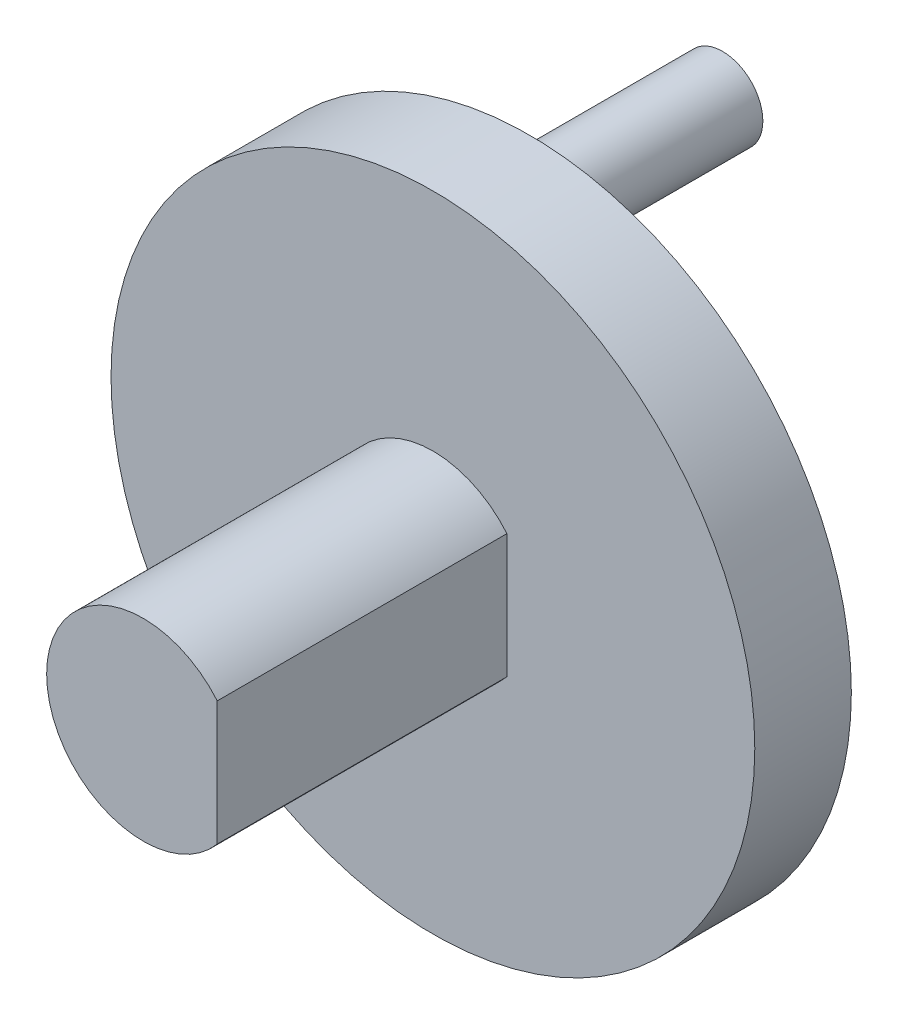
ISO-10303-21;
HEADER;
FILE_DESCRIPTION(('STEP AP214'),'2;1');
FILE_NAME('part.step','',(''),(''),'','','');
FILE_SCHEMA(('AUTOMOTIVE_DESIGN { 1 0 10303 214 1 1 1 1 }'));
ENDSEC;
DATA;
#1=APPLICATION_CONTEXT('core data for automotive mechanical design processes');
#2=APPLICATION_PROTOCOL_DEFINITION('international standard','automotive_design',2000,#1);
#3=PRODUCT_CONTEXT('',#1,'mechanical');
#4=PRODUCT('Part','Part','',(#3));
#5=PRODUCT_RELATED_PRODUCT_CATEGORY('part','',(#4));
#6=PRODUCT_DEFINITION_FORMATION('','',#4);
#7=PRODUCT_DEFINITION_CONTEXT('part definition',#1,'design');
#8=PRODUCT_DEFINITION('design','',#6,#7);
#9=PRODUCT_DEFINITION_SHAPE('','',#8);
#10=(LENGTH_UNIT() NAMED_UNIT(*) SI_UNIT(.MILLI.,.METRE.));
#11=(NAMED_UNIT(*) PLANE_ANGLE_UNIT() SI_UNIT($,.RADIAN.));
#12=(NAMED_UNIT(*) SI_UNIT($,.STERADIAN.) SOLID_ANGLE_UNIT());
#13=UNCERTAINTY_MEASURE_WITH_UNIT(LENGTH_MEASURE(1.E-05),#10,'distance_accuracy_value','');
#14=(GEOMETRIC_REPRESENTATION_CONTEXT(3) GLOBAL_UNCERTAINTY_ASSIGNED_CONTEXT((#13)) GLOBAL_UNIT_ASSIGNED_CONTEXT((#10,
#11,#12)) REPRESENTATION_CONTEXT('',''));
#15=CARTESIAN_POINT('',(0.,0.,0.));
#16=DIRECTION('',(0.,0.,1.));
#17=DIRECTION('',(1.,0.,0.));
#18=AXIS2_PLACEMENT_3D('',#15,#16,#17);
#19=CARTESIAN_POINT('',(0.,0.,12.));
#20=DIRECTION('',(0.,0.,1.));
#21=DIRECTION('',(1.,0.,0.));
#22=AXIS2_PLACEMENT_3D('',#19,#20,#21);
#23=PLANE('',#22);
#24=DIRECTION('',(0.,-1.,0.));
#25=VECTOR('',#24,1.);
#26=CARTESIAN_POINT('',(2.3,4.,12.));
#27=LINE('',#26,#25);
#28=CARTESIAN_POINT('',(2.3,1.926136028426,12.));
#29=VERTEX_POINT('',#28);
#30=CARTESIAN_POINT('',(2.3,-1.926136028426,12.));
#31=VERTEX_POINT('',#30);
#32=EDGE_CURVE('E10',#29,#31,#27,.T.);
#33=ORIENTED_EDGE('',*,*,#32,.F.);
#34=CARTESIAN_POINT('',(0.,0.,12.));
#35=DIRECTION('',(0.,0.,1.));
#36=DIRECTION('',(1.,0.,0.));
#37=AXIS2_PLACEMENT_3D('',#34,#35,#36);
#38=CIRCLE('',#37,3.);
#39=EDGE_CURVE('E75',#29,#31,#38,.T.);
#40=ORIENTED_EDGE('',*,*,#39,.T.);
#41=EDGE_LOOP('',(#33,#40));
#42=FACE_BOUND('',#41,.T.);
#43=ADVANCED_FACE('F16',(#42),#23,.T.);
#44=CARTESIAN_POINT('',(0.,8.,-6.));
#45=DIRECTION('',(0.,0.,1.));
#46=DIRECTION('',(1.,0.,0.));
#47=AXIS2_PLACEMENT_3D('',#44,#45,#46);
#48=PLANE('',#47);
#49=CARTESIAN_POINT('',(0.,8.,-6.));
#50=DIRECTION('',(0.,0.,1.));
#51=DIRECTION('',(1.,0.,0.));
#52=AXIS2_PLACEMENT_3D('',#49,#50,#51);
#53=CIRCLE('',#52,1.25);
#54=CARTESIAN_POINT('',(1.25,8.,-6.));
#55=VERTEX_POINT('',#54);
#56=EDGE_CURVE('E66',#55,#55,#53,.T.);
#57=ORIENTED_EDGE('',*,*,#56,.F.);
#58=EDGE_LOOP('',(#57));
#59=FACE_BOUND('',#58,.T.);
#60=ADVANCED_FACE('F152',(#59),#48,.F.);
#61=CARTESIAN_POINT('',(0.,-8.,-6.));
#62=DIRECTION('',(0.,0.,1.));
#63=DIRECTION('',(1.,0.,0.));
#64=AXIS2_PLACEMENT_3D('',#61,#62,#63);
#65=PLANE('',#64);
#66=CARTESIAN_POINT('',(0.,-8.,-6.));
#67=DIRECTION('',(0.,0.,1.));
#68=DIRECTION('',(1.,0.,0.));
#69=AXIS2_PLACEMENT_3D('',#66,#67,#68);
#70=CIRCLE('',#69,1.25);
#71=CARTESIAN_POINT('',(1.25,-8.,-6.));
#72=VERTEX_POINT('',#71);
#73=EDGE_CURVE('E98',#72,#72,#70,.T.);
#74=ORIENTED_EDGE('',*,*,#73,.F.);
#75=EDGE_LOOP('',(#74));
#76=FACE_BOUND('',#75,.T.);
#77=ADVANCED_FACE('F156',(#76),#65,.F.);
#78=CARTESIAN_POINT('',(2.3,4.,3.));
#79=DIRECTION('',(1.,0.,0.));
#80=DIRECTION('',(0.,1.,0.));
#81=AXIS2_PLACEMENT_3D('',#78,#79,#80);
#82=PLANE('',#81);
#83=DIRECTION('',(0.,-1.,0.));
#84=VECTOR('',#83,1.);
#85=CARTESIAN_POINT('',(2.3,4.,3.));
#86=LINE('',#85,#84);
#87=CARTESIAN_POINT('',(2.3,1.926136028426,3.));
#88=VERTEX_POINT('',#87);
#89=CARTESIAN_POINT('',(2.3,-1.926136028426,3.));
#90=VERTEX_POINT('',#89);
#91=EDGE_CURVE('E94',#88,#90,#86,.T.);
#92=ORIENTED_EDGE('',*,*,#91,.F.);
#93=DIRECTION('',(0.,0.,-1.));
#94=VECTOR('',#93,1.);
#95=CARTESIAN_POINT('',(2.3,1.926136028426,3.));
#96=LINE('',#95,#94);
#97=EDGE_CURVE('E25',#29,#88,#96,.T.);
#98=ORIENTED_EDGE('',*,*,#97,.F.);
#99=ORIENTED_EDGE('',*,*,#32,.T.);
#100=DIRECTION('',(0.,0.,-1.));
#101=VECTOR('',#100,1.);
#102=CARTESIAN_POINT('',(2.3,-1.926136028426,3.));
#103=LINE('',#102,#101);
#104=EDGE_CURVE('E70',#31,#90,#103,.T.);
#105=ORIENTED_EDGE('',*,*,#104,.T.);
#106=EDGE_LOOP('',(#92,#98,#99,#105));
#107=FACE_BOUND('',#106,.T.);
#108=ADVANCED_FACE('F95',(#107),#82,.T.);
#109=CARTESIAN_POINT('',(0.,0.,3.));
#110=DIRECTION('',(0.,0.,-1.));
#111=DIRECTION('',(1.,0.,0.));
#112=AXIS2_PLACEMENT_3D('',#109,#110,#111);
#113=CYLINDRICAL_SURFACE('',#112,3.);
#114=ORIENTED_EDGE('',*,*,#104,.F.);
#115=ORIENTED_EDGE('',*,*,#39,.F.);
#116=ORIENTED_EDGE('',*,*,#97,.T.);
#117=CARTESIAN_POINT('',(0.,0.,3.));
#118=DIRECTION('',(0.,0.,1.));
#119=DIRECTION('',(1.,0.,0.));
#120=AXIS2_PLACEMENT_3D('',#117,#118,#119);
#121=CIRCLE('',#120,3.);
#122=EDGE_CURVE('E91',#88,#90,#121,.T.);
#123=ORIENTED_EDGE('',*,*,#122,.T.);
#124=EDGE_LOOP('',(#114,#115,#116,#123));
#125=FACE_BOUND('',#124,.T.);
#126=ADVANCED_FACE('F89',(#125),#113,.T.);
#127=CARTESIAN_POINT('',(0.,8.,-6.));
#128=DIRECTION('',(0.,0.,-1.));
#129=DIRECTION('',(1.,0.,0.));
#130=AXIS2_PLACEMENT_3D('',#127,#128,#129);
#131=CYLINDRICAL_SURFACE('',#130,1.25);
#132=ORIENTED_EDGE('',*,*,#56,.T.);
#133=DIRECTION('',(0.,0.,1.));
#134=VECTOR('',#133,1.);
#135=CARTESIAN_POINT('',(1.25,8.,-6.));
#136=LINE('',#135,#134);
#137=CARTESIAN_POINT('',(1.25,8.,0.));
#138=VERTEX_POINT('',#137);
#139=EDGE_CURVE('E63',#55,#138,#136,.T.);
#140=ORIENTED_EDGE('',*,*,#139,.T.);
#141=CARTESIAN_POINT('',(0.,8.,0.));
#142=DIRECTION('',(0.,0.,1.));
#143=DIRECTION('',(1.,0.,0.));
#144=AXIS2_PLACEMENT_3D('',#141,#142,#143);
#145=CIRCLE('',#144,1.25);
#146=EDGE_CURVE('E68',#138,#138,#145,.T.);
#147=ORIENTED_EDGE('',*,*,#146,.F.);
#148=ORIENTED_EDGE('',*,*,#139,.F.);
#149=EDGE_LOOP('',(#132,#140,#147,#148));
#150=FACE_BOUND('',#149,.T.);
#151=ADVANCED_FACE('F64',(#150),#131,.T.);
#152=CARTESIAN_POINT('',(0.,-8.,-6.));
#153=DIRECTION('',(0.,0.,-1.));
#154=DIRECTION('',(1.,0.,0.));
#155=AXIS2_PLACEMENT_3D('',#152,#153,#154);
#156=CYLINDRICAL_SURFACE('',#155,1.25);
#157=ORIENTED_EDGE('',*,*,#73,.T.);
#158=DIRECTION('',(0.,0.,1.));
#159=VECTOR('',#158,1.);
#160=CARTESIAN_POINT('',(1.25,-8.,-6.));
#161=LINE('',#160,#159);
#162=CARTESIAN_POINT('',(1.25,-8.,0.));
#163=VERTEX_POINT('',#162);
#164=EDGE_CURVE('E77',#72,#163,#161,.T.);
#165=ORIENTED_EDGE('',*,*,#164,.T.);
#166=CARTESIAN_POINT('',(0.,-8.,0.));
#167=DIRECTION('',(0.,0.,1.));
#168=DIRECTION('',(1.,0.,0.));
#169=AXIS2_PLACEMENT_3D('',#166,#167,#168);
#170=CIRCLE('',#169,1.25);
#171=EDGE_CURVE('E105',#163,#163,#170,.T.);
#172=ORIENTED_EDGE('',*,*,#171,.F.);
#173=ORIENTED_EDGE('',*,*,#164,.F.);
#174=EDGE_LOOP('',(#157,#165,#172,#173));
#175=FACE_BOUND('',#174,.T.);
#176=ADVANCED_FACE('F147',(#175),#156,.T.);
#177=CARTESIAN_POINT('',(0.,0.,3.));
#178=DIRECTION('',(0.,0.,1.));
#179=DIRECTION('',(1.,0.,0.));
#180=AXIS2_PLACEMENT_3D('',#177,#178,#179);
#181=PLANE('',#180);
#182=ORIENTED_EDGE('',*,*,#122,.F.);
#183=ORIENTED_EDGE('',*,*,#91,.T.);
#184=EDGE_LOOP('',(#182,#183));
#185=FACE_BOUND('',#184,.T.);
#186=CARTESIAN_POINT('',(0.,0.,3.));
#187=DIRECTION('',(0.,0.,1.));
#188=DIRECTION('',(1.,0.,0.));
#189=AXIS2_PLACEMENT_3D('',#186,#187,#188);
#190=CIRCLE('',#189,10.);
#191=CARTESIAN_POINT('',(10.,0.,3.));
#192=VERTEX_POINT('',#191);
#193=EDGE_CURVE('E111',#192,#192,#190,.T.);
#194=ORIENTED_EDGE('',*,*,#193,.T.);
#195=EDGE_LOOP('',(#194));
#196=FACE_BOUND('',#195,.T.);
#197=ADVANCED_FACE('F99',(#185,#196),#181,.T.);
#198=CARTESIAN_POINT('',(0.,0.,0.));
#199=DIRECTION('',(0.,0.,1.));
#200=DIRECTION('',(1.,0.,0.));
#201=AXIS2_PLACEMENT_3D('',#198,#199,#200);
#202=PLANE('',#201);
#203=ORIENTED_EDGE('',*,*,#146,.T.);
#204=EDGE_LOOP('',(#203));
#205=FACE_BOUND('',#204,.T.);
#206=ORIENTED_EDGE('',*,*,#171,.T.);
#207=EDGE_LOOP('',(#206));
#208=FACE_BOUND('',#207,.T.);
#209=CARTESIAN_POINT('',(0.,0.,0.));
#210=DIRECTION('',(0.,0.,1.));
#211=DIRECTION('',(1.,0.,0.));
#212=AXIS2_PLACEMENT_3D('',#209,#210,#211);
#213=CIRCLE('',#212,10.);
#214=CARTESIAN_POINT('',(10.,0.,0.));
#215=VERTEX_POINT('',#214);
#216=EDGE_CURVE('E122',#215,#215,#213,.T.);
#217=ORIENTED_EDGE('',*,*,#216,.F.);
#218=EDGE_LOOP('',(#217));
#219=FACE_BOUND('',#218,.T.);
#220=ADVANCED_FACE('F137',(#205,#208,#219),#202,.F.);
#221=CARTESIAN_POINT('',(0.,0.,0.));
#222=DIRECTION('',(0.,0.,-1.));
#223=DIRECTION('',(1.,0.,0.));
#224=AXIS2_PLACEMENT_3D('',#221,#222,#223);
#225=CYLINDRICAL_SURFACE('',#224,10.);
#226=ORIENTED_EDGE('',*,*,#216,.T.);
#227=DIRECTION('',(0.,0.,1.));
#228=VECTOR('',#227,1.);
#229=CARTESIAN_POINT('',(10.,0.,0.));
#230=LINE('',#229,#228);
#231=EDGE_CURVE('E118',#215,#192,#230,.T.);
#232=ORIENTED_EDGE('',*,*,#231,.T.);
#233=ORIENTED_EDGE('',*,*,#193,.F.);
#234=ORIENTED_EDGE('',*,*,#231,.F.);
#235=EDGE_LOOP('',(#226,#232,#233,#234));
#236=FACE_BOUND('',#235,.T.);
#237=ADVANCED_FACE('F133',(#236),#225,.T.);
#238=CLOSED_SHELL('',(#43,#60,#77,#108,#126,#151,#176,#197,#220,#237));
#239=MANIFOLD_SOLID_BREP('B1',#238);
#240=ADVANCED_BREP_SHAPE_REPRESENTATION('',(#18,#239),#14);
#241=SHAPE_DEFINITION_REPRESENTATION(#9,#240);
ENDSEC;
END-ISO-10303-21;
